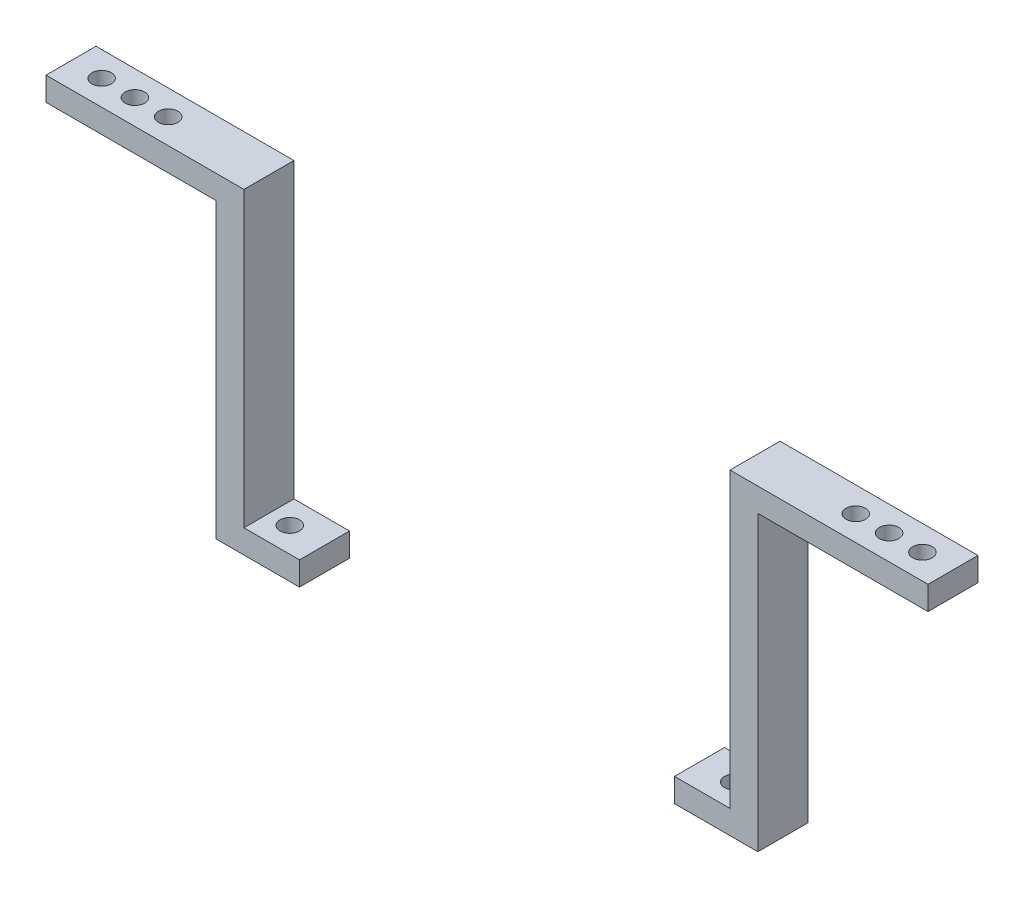
ISO-10303-21;
HEADER;
FILE_DESCRIPTION(('STEP AP214'),'2;1');
FILE_NAME('part.step','',(''),(''),'','','');
FILE_SCHEMA(('AUTOMOTIVE_DESIGN { 1 0 10303 214 1 1 1 1 }'));
ENDSEC;
DATA;
#1=APPLICATION_CONTEXT('core data for automotive mechanical design processes');
#2=APPLICATION_PROTOCOL_DEFINITION('international standard','automotive_design',2000,#1);
#3=PRODUCT_CONTEXT('',#1,'mechanical');
#4=PRODUCT('Part','Part','',(#3));
#5=PRODUCT_RELATED_PRODUCT_CATEGORY('part','',(#4));
#6=PRODUCT_DEFINITION_FORMATION('','',#4);
#7=PRODUCT_DEFINITION_CONTEXT('part definition',#1,'design');
#8=PRODUCT_DEFINITION('design','',#6,#7);
#9=PRODUCT_DEFINITION_SHAPE('','',#8);
#10=(LENGTH_UNIT() NAMED_UNIT(*) SI_UNIT(.MILLI.,.METRE.));
#11=(NAMED_UNIT(*) PLANE_ANGLE_UNIT() SI_UNIT($,.RADIAN.));
#12=(NAMED_UNIT(*) SI_UNIT($,.STERADIAN.) SOLID_ANGLE_UNIT());
#13=UNCERTAINTY_MEASURE_WITH_UNIT(LENGTH_MEASURE(1.E-05),#10,'distance_accuracy_value','');
#14=(GEOMETRIC_REPRESENTATION_CONTEXT(3) GLOBAL_UNCERTAINTY_ASSIGNED_CONTEXT((#13)) GLOBAL_UNIT_ASSIGNED_CONTEXT((#10,
#11,#12)) REPRESENTATION_CONTEXT('',''));
#15=CARTESIAN_POINT('',(0.,0.,0.));
#16=DIRECTION('',(0.,0.,1.));
#17=DIRECTION('',(1.,0.,0.));
#18=AXIS2_PLACEMENT_3D('',#15,#16,#17);
#19=CARTESIAN_POINT('',(0.,4.318,0.));
#20=DIRECTION('',(0.,1.,0.));
#21=DIRECTION('',(0.,0.,1.));
#22=AXIS2_PLACEMENT_3D('',#19,#20,#21);
#23=PLANE('',#22);
#24=DIRECTION('',(0.,0.,1.));
#25=VECTOR('',#24,1.);
#26=CARTESIAN_POINT('',(44.45,4.318,4.572));
#27=LINE('',#26,#25);
#28=CARTESIAN_POINT('',(44.45,4.318,-4.572));
#29=VERTEX_POINT('',#28);
#30=CARTESIAN_POINT('',(44.45,4.318,4.572));
#31=VERTEX_POINT('',#30);
#32=EDGE_CURVE('E60',#29,#31,#27,.T.);
#33=ORIENTED_EDGE('',*,*,#32,.F.);
#34=DIRECTION('',(-1.,0.,0.));
#35=VECTOR('',#34,1.);
#36=CARTESIAN_POINT('',(34.29,4.318,-4.572));
#37=LINE('',#36,#35);
#38=CARTESIAN_POINT('',(34.29,4.318,-4.572));
#39=VERTEX_POINT('',#38);
#40=EDGE_CURVE('E65',#29,#39,#37,.T.);
#41=ORIENTED_EDGE('',*,*,#40,.T.);
#42=DIRECTION('',(0.,0.,1.));
#43=VECTOR('',#42,1.);
#44=CARTESIAN_POINT('',(34.29,4.318,-4.572));
#45=LINE('',#44,#43);
#46=CARTESIAN_POINT('',(34.29,4.318,4.572));
#47=VERTEX_POINT('',#46);
#48=EDGE_CURVE('E96',#39,#47,#45,.T.);
#49=ORIENTED_EDGE('',*,*,#48,.T.);
#50=DIRECTION('',(1.,0.,0.));
#51=VECTOR('',#50,1.);
#52=CARTESIAN_POINT('',(34.29,4.318,4.572));
#53=LINE('',#52,#51);
#54=EDGE_CURVE('E118',#47,#31,#53,.T.);
#55=ORIENTED_EDGE('',*,*,#54,.T.);
#56=EDGE_LOOP('',(#33,#41,#49,#55));
#57=FACE_BOUND('',#56,.T.);
#58=CARTESIAN_POINT('',(40.64,4.318,0.));
#59=DIRECTION('',(0.,1.,0.));
#60=DIRECTION('',(0.,0.,1.));
#61=AXIS2_PLACEMENT_3D('',#58,#59,#60);
#62=CIRCLE('',#61,1.778);
#63=CARTESIAN_POINT('',(40.64,4.318,1.778));
#64=VERTEX_POINT('',#63);
#65=EDGE_CURVE('E107',#64,#64,#62,.T.);
#66=ORIENTED_EDGE('',*,*,#65,.F.);
#67=EDGE_LOOP('',(#66));
#68=FACE_BOUND('',#67,.T.);
#69=ADVANCED_FACE('F43',(#57,#68),#23,.T.);
#70=CARTESIAN_POINT('',(0.,0.,0.));
#71=DIRECTION('',(0.,1.,0.));
#72=DIRECTION('',(0.,0.,1.));
#73=AXIS2_PLACEMENT_3D('',#70,#71,#72);
#74=PLANE('',#73);
#75=DIRECTION('',(0.,0.,1.));
#76=VECTOR('',#75,1.);
#77=CARTESIAN_POINT('',(34.29,0.,-4.572));
#78=LINE('',#77,#76);
#79=CARTESIAN_POINT('',(34.29,0.,-4.572));
#80=VERTEX_POINT('',#79);
#81=CARTESIAN_POINT('',(34.29,0.,4.572));
#82=VERTEX_POINT('',#81);
#83=EDGE_CURVE('E102',#80,#82,#78,.T.);
#84=ORIENTED_EDGE('',*,*,#83,.F.);
#85=DIRECTION('',(-1.,0.,0.));
#86=VECTOR('',#85,1.);
#87=CARTESIAN_POINT('',(34.29,0.,-4.572));
#88=LINE('',#87,#86);
#89=CARTESIAN_POINT('',(49.53,0.,-4.572));
#90=VERTEX_POINT('',#89);
#91=EDGE_CURVE('E85',#90,#80,#88,.T.);
#92=ORIENTED_EDGE('',*,*,#91,.F.);
#93=DIRECTION('',(0.,0.,-1.));
#94=VECTOR('',#93,1.);
#95=CARTESIAN_POINT('',(49.53,0.,-4.572));
#96=LINE('',#95,#94);
#97=CARTESIAN_POINT('',(49.53,0.,4.572));
#98=VERTEX_POINT('',#97);
#99=EDGE_CURVE('E97',#98,#90,#96,.T.);
#100=ORIENTED_EDGE('',*,*,#99,.F.);
#101=DIRECTION('',(1.,0.,0.));
#102=VECTOR('',#101,1.);
#103=CARTESIAN_POINT('',(34.29,0.,4.572));
#104=LINE('',#103,#102);
#105=EDGE_CURVE('E106',#82,#98,#104,.T.);
#106=ORIENTED_EDGE('',*,*,#105,.F.);
#107=EDGE_LOOP('',(#84,#92,#100,#106));
#108=FACE_BOUND('',#107,.T.);
#109=CARTESIAN_POINT('',(40.64,0.,0.));
#110=DIRECTION('',(0.,1.,0.));
#111=DIRECTION('',(0.,0.,1.));
#112=AXIS2_PLACEMENT_3D('',#109,#110,#111);
#113=CIRCLE('',#112,1.778);
#114=CARTESIAN_POINT('',(40.64,0.,1.778));
#115=VERTEX_POINT('',#114);
#116=EDGE_CURVE('E111',#115,#115,#113,.T.);
#117=ORIENTED_EDGE('',*,*,#116,.T.);
#118=EDGE_LOOP('',(#117));
#119=FACE_BOUND('',#118,.T.);
#120=ADVANCED_FACE('F104',(#108,#119),#74,.F.);
#121=CARTESIAN_POINT('',(34.29,4.318,-4.572));
#122=DIRECTION('',(1.,0.,0.));
#123=DIRECTION('',(0.,0.,-1.));
#124=AXIS2_PLACEMENT_3D('',#121,#122,#123);
#125=PLANE('',#124);
#126=ORIENTED_EDGE('',*,*,#83,.T.);
#127=DIRECTION('',(0.,-1.,0.));
#128=VECTOR('',#127,1.);
#129=CARTESIAN_POINT('',(34.29,4.318,4.572));
#130=LINE('',#129,#128);
#131=EDGE_CURVE('E12',#47,#82,#130,.T.);
#132=ORIENTED_EDGE('',*,*,#131,.F.);
#133=ORIENTED_EDGE('',*,*,#48,.F.);
#134=DIRECTION('',(0.,-1.,0.));
#135=VECTOR('',#134,1.);
#136=CARTESIAN_POINT('',(34.29,4.318,-4.572));
#137=LINE('',#136,#135);
#138=EDGE_CURVE('E88',#39,#80,#137,.T.);
#139=ORIENTED_EDGE('',*,*,#138,.T.);
#140=EDGE_LOOP('',(#126,#132,#133,#139));
#141=FACE_BOUND('',#140,.T.);
#142=ADVANCED_FACE('F45',(#141),#125,.F.);
#143=CARTESIAN_POINT('',(34.29,4.318,4.572));
#144=DIRECTION('',(0.,0.,-1.));
#145=DIRECTION('',(-1.,0.,0.));
#146=AXIS2_PLACEMENT_3D('',#143,#144,#145);
#147=PLANE('',#146);
#148=ORIENTED_EDGE('',*,*,#105,.T.);
#149=DIRECTION('',(0.,-1.,0.));
#150=VECTOR('',#149,1.);
#151=CARTESIAN_POINT('',(49.53,4.318,4.572));
#152=LINE('',#151,#150);
#153=CARTESIAN_POINT('',(49.53,53.594,4.572));
#154=VERTEX_POINT('',#153);
#155=EDGE_CURVE('E52',#154,#98,#152,.T.);
#156=ORIENTED_EDGE('',*,*,#155,.F.);
#157=DIRECTION('',(1.,0.,0.));
#158=VECTOR('',#157,1.);
#159=CARTESIAN_POINT('',(44.45,53.594,4.572));
#160=LINE('',#159,#158);
#161=CARTESIAN_POINT('',(80.645,53.594,4.57199999999999));
#162=VERTEX_POINT('',#161);
#163=EDGE_CURVE('E154',#154,#162,#160,.T.);
#164=ORIENTED_EDGE('',*,*,#163,.T.);
#165=DIRECTION('',(0.,-1.,0.));
#166=VECTOR('',#165,1.);
#167=CARTESIAN_POINT('',(80.645,57.912,4.57199999999999));
#168=LINE('',#167,#166);
#169=CARTESIAN_POINT('',(80.645,57.912,4.57199999999999));
#170=VERTEX_POINT('',#169);
#171=EDGE_CURVE('E133',#170,#162,#168,.T.);
#172=ORIENTED_EDGE('',*,*,#171,.F.);
#173=DIRECTION('',(1.,0.,0.));
#174=VECTOR('',#173,1.);
#175=CARTESIAN_POINT('',(44.45,57.912,4.572));
#176=LINE('',#175,#174);
#177=CARTESIAN_POINT('',(44.45,57.912,4.572));
#178=VERTEX_POINT('',#177);
#179=EDGE_CURVE('E175',#178,#170,#176,.T.);
#180=ORIENTED_EDGE('',*,*,#179,.F.);
#181=DIRECTION('',(0.,-1.,0.));
#182=VECTOR('',#181,1.);
#183=CARTESIAN_POINT('',(44.45,53.594,4.572));
#184=LINE('',#183,#182);
#185=EDGE_CURVE('E134',#178,#31,#184,.T.);
#186=ORIENTED_EDGE('',*,*,#185,.T.);
#187=ORIENTED_EDGE('',*,*,#54,.F.);
#188=ORIENTED_EDGE('',*,*,#131,.T.);
#189=EDGE_LOOP('',(#148,#156,#164,#172,#180,#186,#187,#188));
#190=FACE_BOUND('',#189,.T.);
#191=ADVANCED_FACE('F228',(#190),#147,.F.);
#192=CARTESIAN_POINT('',(49.53,4.318,-4.572));
#193=DIRECTION('',(-1.,0.,0.));
#194=DIRECTION('',(0.,0.,1.));
#195=AXIS2_PLACEMENT_3D('',#192,#193,#194);
#196=PLANE('',#195);
#197=ORIENTED_EDGE('',*,*,#99,.T.);
#198=DIRECTION('',(0.,-1.,0.));
#199=VECTOR('',#198,1.);
#200=CARTESIAN_POINT('',(49.53,4.318,-4.572));
#201=LINE('',#200,#199);
#202=CARTESIAN_POINT('',(49.53,53.594,-4.572));
#203=VERTEX_POINT('',#202);
#204=EDGE_CURVE('E92',#203,#90,#201,.T.);
#205=ORIENTED_EDGE('',*,*,#204,.F.);
#206=DIRECTION('',(0.,0.,-1.));
#207=VECTOR('',#206,1.);
#208=CARTESIAN_POINT('',(49.53,53.594,4.572));
#209=LINE('',#208,#207);
#210=EDGE_CURVE('E132',#154,#203,#209,.T.);
#211=ORIENTED_EDGE('',*,*,#210,.F.);
#212=ORIENTED_EDGE('',*,*,#155,.T.);
#213=EDGE_LOOP('',(#197,#205,#211,#212));
#214=FACE_BOUND('',#213,.T.);
#215=ADVANCED_FACE('F229',(#214),#196,.F.);
#216=CARTESIAN_POINT('',(34.29,4.318,-4.572));
#217=DIRECTION('',(0.,0.,1.));
#218=DIRECTION('',(1.,0.,0.));
#219=AXIS2_PLACEMENT_3D('',#216,#217,#218);
#220=PLANE('',#219);
#221=ORIENTED_EDGE('',*,*,#91,.T.);
#222=ORIENTED_EDGE('',*,*,#138,.F.);
#223=ORIENTED_EDGE('',*,*,#40,.F.);
#224=DIRECTION('',(0.,-1.,0.));
#225=VECTOR('',#224,1.);
#226=CARTESIAN_POINT('',(44.45,53.594,-4.572));
#227=LINE('',#226,#225);
#228=CARTESIAN_POINT('',(44.45,57.912,-4.572));
#229=VERTEX_POINT('',#228);
#230=EDGE_CURVE('E125',#229,#29,#227,.T.);
#231=ORIENTED_EDGE('',*,*,#230,.F.);
#232=DIRECTION('',(-1.,0.,0.));
#233=VECTOR('',#232,1.);
#234=CARTESIAN_POINT('',(44.45,57.912,-4.572));
#235=LINE('',#234,#233);
#236=CARTESIAN_POINT('',(80.645,57.912,-4.57200000000001));
#237=VERTEX_POINT('',#236);
#238=EDGE_CURVE('E182',#237,#229,#235,.T.);
#239=ORIENTED_EDGE('',*,*,#238,.F.);
#240=DIRECTION('',(0.,-1.,0.));
#241=VECTOR('',#240,1.);
#242=CARTESIAN_POINT('',(80.645,57.912,-4.57200000000001));
#243=LINE('',#242,#241);
#244=CARTESIAN_POINT('',(80.645,53.594,-4.57200000000001));
#245=VERTEX_POINT('',#244);
#246=EDGE_CURVE('E185',#237,#245,#243,.T.);
#247=ORIENTED_EDGE('',*,*,#246,.T.);
#248=DIRECTION('',(-1.,0.,0.));
#249=VECTOR('',#248,1.);
#250=CARTESIAN_POINT('',(44.45,53.594,-4.572));
#251=LINE('',#250,#249);
#252=EDGE_CURVE('E176',#245,#203,#251,.T.);
#253=ORIENTED_EDGE('',*,*,#252,.T.);
#254=ORIENTED_EDGE('',*,*,#204,.T.);
#255=EDGE_LOOP('',(#221,#222,#223,#231,#239,#247,#253,#254));
#256=FACE_BOUND('',#255,.T.);
#257=ADVANCED_FACE('F87',(#256),#220,.F.);
#258=CARTESIAN_POINT('',(40.64,4.318,0.));
#259=DIRECTION('',(0.,-1.,0.));
#260=DIRECTION('',(0.,0.,-1.));
#261=AXIS2_PLACEMENT_3D('',#258,#259,#260);
#262=CYLINDRICAL_SURFACE('',#261,1.778);
#263=ORIENTED_EDGE('',*,*,#65,.T.);
#264=EDGE_LOOP('',(#263));
#265=FACE_BOUND('',#264,.T.);
#266=ORIENTED_EDGE('',*,*,#116,.F.);
#267=EDGE_LOOP('',(#266));
#268=FACE_BOUND('',#267,.T.);
#269=ADVANCED_FACE('F236',(#265,#268),#262,.F.);
#270=CARTESIAN_POINT('',(44.45,53.594,4.572));
#271=DIRECTION('',(1.,0.,0.));
#272=DIRECTION('',(0.,0.,-1.));
#273=AXIS2_PLACEMENT_3D('',#270,#271,#272);
#274=PLANE('',#273);
#275=ORIENTED_EDGE('',*,*,#32,.T.);
#276=ORIENTED_EDGE('',*,*,#185,.F.);
#277=DIRECTION('',(0.,0.,1.));
#278=VECTOR('',#277,1.);
#279=CARTESIAN_POINT('',(44.45,57.912,4.572));
#280=LINE('',#279,#278);
#281=EDGE_CURVE('E172',#229,#178,#280,.T.);
#282=ORIENTED_EDGE('',*,*,#281,.F.);
#283=ORIENTED_EDGE('',*,*,#230,.T.);
#284=EDGE_LOOP('',(#275,#276,#282,#283));
#285=FACE_BOUND('',#284,.T.);
#286=ADVANCED_FACE('F248',(#285),#274,.F.);
#287=CARTESIAN_POINT('',(80.645,57.912,4.57199999999999));
#288=DIRECTION('',(-1.,0.,0.));
#289=DIRECTION('',(0.,0.,1.));
#290=AXIS2_PLACEMENT_3D('',#287,#288,#289);
#291=PLANE('',#290);
#292=DIRECTION('',(0.,0.,-1.));
#293=VECTOR('',#292,1.);
#294=CARTESIAN_POINT('',(80.645,53.594,4.57199999999999));
#295=LINE('',#294,#293);
#296=EDGE_CURVE('E188',#162,#245,#295,.T.);
#297=ORIENTED_EDGE('',*,*,#296,.T.);
#298=ORIENTED_EDGE('',*,*,#246,.F.);
#299=DIRECTION('',(0.,0.,-1.));
#300=VECTOR('',#299,1.);
#301=CARTESIAN_POINT('',(80.645,57.912,4.57199999999999));
#302=LINE('',#301,#300);
#303=EDGE_CURVE('E179',#170,#237,#302,.T.);
#304=ORIENTED_EDGE('',*,*,#303,.F.);
#305=ORIENTED_EDGE('',*,*,#171,.T.);
#306=EDGE_LOOP('',(#297,#298,#304,#305));
#307=FACE_BOUND('',#306,.T.);
#308=ADVANCED_FACE('F207',(#307),#291,.F.);
#309=CARTESIAN_POINT('',(0.,57.912,0.));
#310=DIRECTION('',(0.,-1.,0.));
#311=DIRECTION('',(0.,0.,-1.));
#312=AXIS2_PLACEMENT_3D('',#309,#310,#311);
#313=PLANE('',#312);
#314=CARTESIAN_POINT('',(62.865,57.912,0.));
#315=DIRECTION('',(0.,1.,0.));
#316=DIRECTION('',(0.,0.,1.));
#317=AXIS2_PLACEMENT_3D('',#314,#315,#316);
#318=CIRCLE('',#317,1.77800000000001);
#319=CARTESIAN_POINT('',(62.865,57.912,1.77800000000001));
#320=VERTEX_POINT('',#319);
#321=EDGE_CURVE('E158',#320,#320,#318,.T.);
#322=ORIENTED_EDGE('',*,*,#321,.F.);
#323=EDGE_LOOP('',(#322));
#324=FACE_BOUND('',#323,.T.);
#325=CARTESIAN_POINT('',(68.961,57.912,0.));
#326=DIRECTION('',(0.,1.,0.));
#327=DIRECTION('',(0.,0.,1.));
#328=AXIS2_PLACEMENT_3D('',#325,#326,#327);
#329=CIRCLE('',#328,1.77800000000001);
#330=CARTESIAN_POINT('',(68.961,57.912,1.77800000000001));
#331=VERTEX_POINT('',#330);
#332=EDGE_CURVE('E163',#331,#331,#329,.T.);
#333=ORIENTED_EDGE('',*,*,#332,.F.);
#334=EDGE_LOOP('',(#333));
#335=FACE_BOUND('',#334,.T.);
#336=CARTESIAN_POINT('',(75.057,57.912,0.));
#337=DIRECTION('',(0.,1.,0.));
#338=DIRECTION('',(0.,0.,1.));
#339=AXIS2_PLACEMENT_3D('',#336,#337,#338);
#340=CIRCLE('',#339,1.77800000000001);
#341=CARTESIAN_POINT('',(75.057,57.912,1.77800000000001));
#342=VERTEX_POINT('',#341);
#343=EDGE_CURVE('E155',#342,#342,#340,.T.);
#344=ORIENTED_EDGE('',*,*,#343,.F.);
#345=EDGE_LOOP('',(#344));
#346=FACE_BOUND('',#345,.T.);
#347=ORIENTED_EDGE('',*,*,#281,.T.);
#348=ORIENTED_EDGE('',*,*,#179,.T.);
#349=ORIENTED_EDGE('',*,*,#303,.T.);
#350=ORIENTED_EDGE('',*,*,#238,.T.);
#351=EDGE_LOOP('',(#347,#348,#349,#350));
#352=FACE_BOUND('',#351,.T.);
#353=ADVANCED_FACE('F255',(#324,#335,#346,#352),#313,.F.);
#354=CARTESIAN_POINT('',(0.,53.594,0.));
#355=DIRECTION('',(0.,-1.,0.));
#356=DIRECTION('',(0.,0.,-1.));
#357=AXIS2_PLACEMENT_3D('',#354,#355,#356);
#358=PLANE('',#357);
#359=CARTESIAN_POINT('',(62.865,53.594,0.));
#360=DIRECTION('',(0.,-1.,0.));
#361=DIRECTION('',(0.,0.,-1.));
#362=AXIS2_PLACEMENT_3D('',#359,#360,#361);
#363=CIRCLE('',#362,1.77800000000001);
#364=CARTESIAN_POINT('',(62.865,53.594,-1.77800000000001));
#365=VERTEX_POINT('',#364);
#366=EDGE_CURVE('E47',#365,#365,#363,.T.);
#367=ORIENTED_EDGE('',*,*,#366,.F.);
#368=EDGE_LOOP('',(#367));
#369=FACE_BOUND('',#368,.T.);
#370=CARTESIAN_POINT('',(68.961,53.594,0.));
#371=DIRECTION('',(0.,-1.,0.));
#372=DIRECTION('',(0.,0.,-1.));
#373=AXIS2_PLACEMENT_3D('',#370,#371,#372);
#374=CIRCLE('',#373,1.77800000000001);
#375=CARTESIAN_POINT('',(68.961,53.594,-1.77800000000001));
#376=VERTEX_POINT('',#375);
#377=EDGE_CURVE('E156',#376,#376,#374,.T.);
#378=ORIENTED_EDGE('',*,*,#377,.F.);
#379=EDGE_LOOP('',(#378));
#380=FACE_BOUND('',#379,.T.);
#381=CARTESIAN_POINT('',(75.057,53.594,0.));
#382=DIRECTION('',(0.,-1.,0.));
#383=DIRECTION('',(0.,0.,-1.));
#384=AXIS2_PLACEMENT_3D('',#381,#382,#383);
#385=CIRCLE('',#384,1.77800000000001);
#386=CARTESIAN_POINT('',(75.057,53.594,-1.77800000000001));
#387=VERTEX_POINT('',#386);
#388=EDGE_CURVE('E152',#387,#387,#385,.T.);
#389=ORIENTED_EDGE('',*,*,#388,.F.);
#390=EDGE_LOOP('',(#389));
#391=FACE_BOUND('',#390,.T.);
#392=ORIENTED_EDGE('',*,*,#163,.F.);
#393=ORIENTED_EDGE('',*,*,#210,.T.);
#394=ORIENTED_EDGE('',*,*,#252,.F.);
#395=ORIENTED_EDGE('',*,*,#296,.F.);
#396=EDGE_LOOP('',(#392,#393,#394,#395));
#397=FACE_BOUND('',#396,.T.);
#398=ADVANCED_FACE('F214',(#369,#380,#391,#397),#358,.T.);
#399=CARTESIAN_POINT('',(75.057,-2.50000000007189E-05,0.));
#400=DIRECTION('',(0.,1.,0.));
#401=DIRECTION('',(0.,0.,1.));
#402=AXIS2_PLACEMENT_3D('',#399,#400,#401);
#403=CYLINDRICAL_SURFACE('',#402,1.77800000000001);
#404=ORIENTED_EDGE('',*,*,#388,.T.);
#405=EDGE_LOOP('',(#404));
#406=FACE_BOUND('',#405,.T.);
#407=ORIENTED_EDGE('',*,*,#343,.T.);
#408=EDGE_LOOP('',(#407));
#409=FACE_BOUND('',#408,.T.);
#410=ADVANCED_FACE('F258',(#406,#409),#403,.F.);
#411=CARTESIAN_POINT('',(68.961,-2.50000000007189E-05,0.));
#412=DIRECTION('',(0.,1.,0.));
#413=DIRECTION('',(0.,0.,1.));
#414=AXIS2_PLACEMENT_3D('',#411,#412,#413);
#415=CYLINDRICAL_SURFACE('',#414,1.77800000000001);
#416=ORIENTED_EDGE('',*,*,#377,.T.);
#417=EDGE_LOOP('',(#416));
#418=FACE_BOUND('',#417,.T.);
#419=ORIENTED_EDGE('',*,*,#332,.T.);
#420=EDGE_LOOP('',(#419));
#421=FACE_BOUND('',#420,.T.);
#422=ADVANCED_FACE('F265',(#418,#421),#415,.F.);
#423=CARTESIAN_POINT('',(62.865,-2.50000000007189E-05,0.));
#424=DIRECTION('',(0.,1.,0.));
#425=DIRECTION('',(0.,0.,1.));
#426=AXIS2_PLACEMENT_3D('',#423,#424,#425);
#427=CYLINDRICAL_SURFACE('',#426,1.77800000000001);
#428=ORIENTED_EDGE('',*,*,#366,.T.);
#429=EDGE_LOOP('',(#428));
#430=FACE_BOUND('',#429,.T.);
#431=ORIENTED_EDGE('',*,*,#321,.T.);
#432=EDGE_LOOP('',(#431));
#433=FACE_BOUND('',#432,.T.);
#434=ADVANCED_FACE('F269',(#430,#433),#427,.F.);
#435=CLOSED_SHELL('',(#69,#120,#142,#191,#215,#257,#269,#286,#308,#353,#398,#410,#422,#434));
#436=MANIFOLD_SOLID_BREP('B2',#435);
#437=CARTESIAN_POINT('',(0.,4.318,0.));
#438=DIRECTION('',(0.,1.,0.));
#439=DIRECTION('',(0.,0.,1.));
#440=AXIS2_PLACEMENT_3D('',#437,#438,#439);
#441=PLANE('',#440);
#442=DIRECTION('',(0.,0.,-1.));
#443=VECTOR('',#442,1.);
#444=CARTESIAN_POINT('',(-44.45,4.318,-4.572));
#445=LINE('',#444,#443);
#446=CARTESIAN_POINT('',(-44.45,4.318,4.572));
#447=VERTEX_POINT('',#446);
#448=CARTESIAN_POINT('',(-44.45,4.318,-4.572));
#449=VERTEX_POINT('',#448);
#450=EDGE_CURVE('E410',#447,#449,#445,.T.);
#451=ORIENTED_EDGE('',*,*,#450,.F.);
#452=DIRECTION('',(1.,0.,0.));
#453=VECTOR('',#452,1.);
#454=CARTESIAN_POINT('',(-49.53,4.318,4.572));
#455=LINE('',#454,#453);
#456=CARTESIAN_POINT('',(-34.29,4.318,4.572));
#457=VERTEX_POINT('',#456);
#458=EDGE_CURVE('E447',#447,#457,#455,.T.);
#459=ORIENTED_EDGE('',*,*,#458,.T.);
#460=DIRECTION('',(0.,0.,-1.));
#461=VECTOR('',#460,1.);
#462=CARTESIAN_POINT('',(-34.29,4.318,-4.572));
#463=LINE('',#462,#461);
#464=CARTESIAN_POINT('',(-34.29,4.318,-4.572));
#465=VERTEX_POINT('',#464);
#466=EDGE_CURVE('E416',#457,#465,#463,.T.);
#467=ORIENTED_EDGE('',*,*,#466,.T.);
#468=DIRECTION('',(-1.,0.,0.));
#469=VECTOR('',#468,1.);
#470=CARTESIAN_POINT('',(-49.53,4.318,-4.572));
#471=LINE('',#470,#469);
#472=EDGE_CURVE('E457',#465,#449,#471,.T.);
#473=ORIENTED_EDGE('',*,*,#472,.T.);
#474=EDGE_LOOP('',(#451,#459,#467,#473));
#475=FACE_BOUND('',#474,.T.);
#476=CARTESIAN_POINT('',(-40.64,4.318,0.));
#477=DIRECTION('',(0.,1.,0.));
#478=DIRECTION('',(0.,0.,1.));
#479=AXIS2_PLACEMENT_3D('',#476,#477,#478);
#480=CIRCLE('',#479,1.778);
#481=CARTESIAN_POINT('',(-40.64,4.318,1.778));
#482=VERTEX_POINT('',#481);
#483=EDGE_CURVE('E461',#482,#482,#480,.T.);
#484=ORIENTED_EDGE('',*,*,#483,.F.);
#485=EDGE_LOOP('',(#484));
#486=FACE_BOUND('',#485,.T.);
#487=ADVANCED_FACE('F393',(#475,#486),#441,.T.);
#488=CARTESIAN_POINT('',(0.,0.,0.));
#489=DIRECTION('',(0.,1.,0.));
#490=DIRECTION('',(0.,0.,1.));
#491=AXIS2_PLACEMENT_3D('',#488,#489,#490);
#492=PLANE('',#491);
#493=DIRECTION('',(0.,0.,1.));
#494=VECTOR('',#493,1.);
#495=CARTESIAN_POINT('',(-49.53,0.,-4.572));
#496=LINE('',#495,#494);
#497=CARTESIAN_POINT('',(-49.53,0.,-4.572));
#498=VERTEX_POINT('',#497);
#499=CARTESIAN_POINT('',(-49.53,0.,4.572));
#500=VERTEX_POINT('',#499);
#501=EDGE_CURVE('E453',#498,#500,#496,.T.);
#502=ORIENTED_EDGE('',*,*,#501,.F.);
#503=DIRECTION('',(-1.,0.,0.));
#504=VECTOR('',#503,1.);
#505=CARTESIAN_POINT('',(-49.53,0.,-4.572));
#506=LINE('',#505,#504);
#507=CARTESIAN_POINT('',(-34.29,0.,-4.572));
#508=VERTEX_POINT('',#507);
#509=EDGE_CURVE('E436',#508,#498,#506,.T.);
#510=ORIENTED_EDGE('',*,*,#509,.F.);
#511=DIRECTION('',(0.,0.,-1.));
#512=VECTOR('',#511,1.);
#513=CARTESIAN_POINT('',(-34.29,0.,-4.572));
#514=LINE('',#513,#512);
#515=CARTESIAN_POINT('',(-34.29,0.,4.572));
#516=VERTEX_POINT('',#515);
#517=EDGE_CURVE('E448',#516,#508,#514,.T.);
#518=ORIENTED_EDGE('',*,*,#517,.F.);
#519=DIRECTION('',(1.,0.,0.));
#520=VECTOR('',#519,1.);
#521=CARTESIAN_POINT('',(-49.53,0.,4.572));
#522=LINE('',#521,#520);
#523=EDGE_CURVE('E460',#500,#516,#522,.T.);
#524=ORIENTED_EDGE('',*,*,#523,.F.);
#525=EDGE_LOOP('',(#502,#510,#518,#524));
#526=FACE_BOUND('',#525,.T.);
#527=CARTESIAN_POINT('',(-40.64,0.,0.));
#528=DIRECTION('',(0.,1.,0.));
#529=DIRECTION('',(0.,0.,1.));
#530=AXIS2_PLACEMENT_3D('',#527,#528,#529);
#531=CIRCLE('',#530,1.778);
#532=CARTESIAN_POINT('',(-40.64,0.,1.778));
#533=VERTEX_POINT('',#532);
#534=EDGE_CURVE('E465',#533,#533,#531,.T.);
#535=ORIENTED_EDGE('',*,*,#534,.T.);
#536=EDGE_LOOP('',(#535));
#537=FACE_BOUND('',#536,.T.);
#538=ADVANCED_FACE('F458',(#526,#537),#492,.F.);
#539=CARTESIAN_POINT('',(-49.53,4.318,-4.572));
#540=DIRECTION('',(1.,0.,0.));
#541=DIRECTION('',(0.,0.,-1.));
#542=AXIS2_PLACEMENT_3D('',#539,#540,#541);
#543=PLANE('',#542);
#544=ORIENTED_EDGE('',*,*,#501,.T.);
#545=DIRECTION('',(0.,-1.,0.));
#546=VECTOR('',#545,1.);
#547=CARTESIAN_POINT('',(-49.53,4.318,4.572));
#548=LINE('',#547,#546);
#549=CARTESIAN_POINT('',(-49.53,53.594,4.572));
#550=VERTEX_POINT('',#549);
#551=EDGE_CURVE('E41',#550,#500,#548,.T.);
#552=ORIENTED_EDGE('',*,*,#551,.F.);
#553=DIRECTION('',(0.,0.,1.));
#554=VECTOR('',#553,1.);
#555=CARTESIAN_POINT('',(-49.53,53.594,-4.572));
#556=LINE('',#555,#554);
#557=CARTESIAN_POINT('',(-49.53,53.594,-4.572));
#558=VERTEX_POINT('',#557);
#559=EDGE_CURVE('E455',#558,#550,#556,.T.);
#560=ORIENTED_EDGE('',*,*,#559,.F.);
#561=DIRECTION('',(0.,-1.,0.));
#562=VECTOR('',#561,1.);
#563=CARTESIAN_POINT('',(-49.53,4.318,-4.572));
#564=LINE('',#563,#562);
#565=EDGE_CURVE('E440',#558,#498,#564,.T.);
#566=ORIENTED_EDGE('',*,*,#565,.T.);
#567=EDGE_LOOP('',(#544,#552,#560,#566));
#568=FACE_BOUND('',#567,.T.);
#569=ADVANCED_FACE('F395',(#568),#543,.F.);
#570=CARTESIAN_POINT('',(-49.53,4.318,4.572));
#571=DIRECTION('',(0.,0.,-1.));
#572=DIRECTION('',(-1.,0.,0.));
#573=AXIS2_PLACEMENT_3D('',#570,#571,#572);
#574=PLANE('',#573);
#575=ORIENTED_EDGE('',*,*,#523,.T.);
#576=DIRECTION('',(0.,-1.,0.));
#577=VECTOR('',#576,1.);
#578=CARTESIAN_POINT('',(-34.29,4.318,4.572));
#579=LINE('',#578,#577);
#580=EDGE_CURVE('E402',#457,#516,#579,.T.);
#581=ORIENTED_EDGE('',*,*,#580,.F.);
#582=ORIENTED_EDGE('',*,*,#458,.F.);
#583=DIRECTION('',(0.,-1.,0.));
#584=VECTOR('',#583,1.);
#585=CARTESIAN_POINT('',(-44.45,53.594,4.572));
#586=LINE('',#585,#584);
#587=CARTESIAN_POINT('',(-44.45,57.912,4.572));
#588=VERTEX_POINT('',#587);
#589=EDGE_CURVE('E493',#588,#447,#586,.T.);
#590=ORIENTED_EDGE('',*,*,#589,.F.);
#591=DIRECTION('',(1.,0.,0.));
#592=VECTOR('',#591,1.);
#593=CARTESIAN_POINT('',(-44.45,57.912,4.572));
#594=LINE('',#593,#592);
#595=CARTESIAN_POINT('',(-80.645,57.912,4.572));
#596=VERTEX_POINT('',#595);
#597=EDGE_CURVE('E523',#596,#588,#594,.T.);
#598=ORIENTED_EDGE('',*,*,#597,.F.);
#599=DIRECTION('',(0.,-1.,0.));
#600=VECTOR('',#599,1.);
#601=CARTESIAN_POINT('',(-80.645,57.912,4.572));
#602=LINE('',#601,#600);
#603=CARTESIAN_POINT('',(-80.645,53.594,4.572));
#604=VERTEX_POINT('',#603);
#605=EDGE_CURVE('E528',#596,#604,#602,.T.);
#606=ORIENTED_EDGE('',*,*,#605,.T.);
#607=DIRECTION('',(1.,0.,0.));
#608=VECTOR('',#607,1.);
#609=CARTESIAN_POINT('',(-44.45,53.594,4.572));
#610=LINE('',#609,#608);
#611=EDGE_CURVE('E517',#604,#550,#610,.T.);
#612=ORIENTED_EDGE('',*,*,#611,.T.);
#613=ORIENTED_EDGE('',*,*,#551,.T.);
#614=EDGE_LOOP('',(#575,#581,#582,#590,#598,#606,#612,#613));
#615=FACE_BOUND('',#614,.T.);
#616=ADVANCED_FACE('F560',(#615),#574,.F.);
#617=CARTESIAN_POINT('',(-34.29,4.318,-4.572));
#618=DIRECTION('',(-1.,0.,0.));
#619=DIRECTION('',(0.,0.,1.));
#620=AXIS2_PLACEMENT_3D('',#617,#618,#619);
#621=PLANE('',#620);
#622=ORIENTED_EDGE('',*,*,#517,.T.);
#623=DIRECTION('',(0.,-1.,0.));
#624=VECTOR('',#623,1.);
#625=CARTESIAN_POINT('',(-34.29,4.318,-4.572));
#626=LINE('',#625,#624);
#627=EDGE_CURVE('E443',#465,#508,#626,.T.);
#628=ORIENTED_EDGE('',*,*,#627,.F.);
#629=ORIENTED_EDGE('',*,*,#466,.F.);
#630=ORIENTED_EDGE('',*,*,#580,.T.);
#631=EDGE_LOOP('',(#622,#628,#629,#630));
#632=FACE_BOUND('',#631,.T.);
#633=ADVANCED_FACE('F568',(#632),#621,.F.);
#634=CARTESIAN_POINT('',(-49.53,4.318,-4.572));
#635=DIRECTION('',(0.,0.,1.));
#636=DIRECTION('',(1.,0.,0.));
#637=AXIS2_PLACEMENT_3D('',#634,#635,#636);
#638=PLANE('',#637);
#639=ORIENTED_EDGE('',*,*,#509,.T.);
#640=ORIENTED_EDGE('',*,*,#565,.F.);
#641=DIRECTION('',(-1.,0.,0.));
#642=VECTOR('',#641,1.);
#643=CARTESIAN_POINT('',(-44.45,53.594,-4.572));
#644=LINE('',#643,#642);
#645=CARTESIAN_POINT('',(-80.645,53.594,-4.572));
#646=VERTEX_POINT('',#645);
#647=EDGE_CURVE('E511',#558,#646,#644,.T.);
#648=ORIENTED_EDGE('',*,*,#647,.T.);
#649=DIRECTION('',(0.,-1.,0.));
#650=VECTOR('',#649,1.);
#651=CARTESIAN_POINT('',(-80.645,57.912,-4.572));
#652=LINE('',#651,#650);
#653=CARTESIAN_POINT('',(-80.645,57.912,-4.572));
#654=VERTEX_POINT('',#653);
#655=EDGE_CURVE('E494',#654,#646,#652,.T.);
#656=ORIENTED_EDGE('',*,*,#655,.F.);
#657=DIRECTION('',(-1.,0.,0.));
#658=VECTOR('',#657,1.);
#659=CARTESIAN_POINT('',(-44.45,57.912,-4.572));
#660=LINE('',#659,#658);
#661=CARTESIAN_POINT('',(-44.45,57.912,-4.572));
#662=VERTEX_POINT('',#661);
#663=EDGE_CURVE('E497',#662,#654,#660,.T.);
#664=ORIENTED_EDGE('',*,*,#663,.F.);
#665=DIRECTION('',(0.,-1.,0.));
#666=VECTOR('',#665,1.);
#667=CARTESIAN_POINT('',(-44.45,53.594,-4.572));
#668=LINE('',#667,#666);
#669=EDGE_CURVE('E490',#662,#449,#668,.T.);
#670=ORIENTED_EDGE('',*,*,#669,.T.);
#671=ORIENTED_EDGE('',*,*,#472,.F.);
#672=ORIENTED_EDGE('',*,*,#627,.T.);
#673=EDGE_LOOP('',(#639,#640,#648,#656,#664,#670,#671,#672));
#674=FACE_BOUND('',#673,.T.);
#675=ADVANCED_FACE('F438',(#674),#638,.F.);
#676=CARTESIAN_POINT('',(-40.64,4.318,0.));
#677=DIRECTION('',(0.,-1.,0.));
#678=DIRECTION('',(0.,0.,-1.));
#679=AXIS2_PLACEMENT_3D('',#676,#677,#678);
#680=CYLINDRICAL_SURFACE('',#679,1.778);
#681=ORIENTED_EDGE('',*,*,#483,.T.);
#682=EDGE_LOOP('',(#681));
#683=FACE_BOUND('',#682,.T.);
#684=ORIENTED_EDGE('',*,*,#534,.F.);
#685=EDGE_LOOP('',(#684));
#686=FACE_BOUND('',#685,.T.);
#687=ADVANCED_FACE('F575',(#683,#686),#680,.F.);
#688=CARTESIAN_POINT('',(-44.45,53.594,-4.572));
#689=DIRECTION('',(-1.,0.,0.));
#690=DIRECTION('',(0.,0.,1.));
#691=AXIS2_PLACEMENT_3D('',#688,#689,#690);
#692=PLANE('',#691);
#693=ORIENTED_EDGE('',*,*,#450,.T.);
#694=ORIENTED_EDGE('',*,*,#669,.F.);
#695=DIRECTION('',(0.,0.,-1.));
#696=VECTOR('',#695,1.);
#697=CARTESIAN_POINT('',(-44.45,57.912,4.572));
#698=LINE('',#697,#696);
#699=EDGE_CURVE('E548',#588,#662,#698,.T.);
#700=ORIENTED_EDGE('',*,*,#699,.F.);
#701=ORIENTED_EDGE('',*,*,#589,.T.);
#702=EDGE_LOOP('',(#693,#694,#700,#701));
#703=FACE_BOUND('',#702,.T.);
#704=ADVANCED_FACE('F487',(#703),#692,.F.);
#705=CARTESIAN_POINT('',(0.,53.594,0.));
#706=DIRECTION('',(0.,1.,0.));
#707=DIRECTION('',(0.,0.,1.));
#708=AXIS2_PLACEMENT_3D('',#705,#706,#707);
#709=PLANE('',#708);
#710=CARTESIAN_POINT('',(-68.961,53.594,0.));
#711=DIRECTION('',(0.,1.,0.));
#712=DIRECTION('',(0.,0.,1.));
#713=AXIS2_PLACEMENT_3D('',#710,#711,#712);
#714=CIRCLE('',#713,1.77800000000001);
#715=CARTESIAN_POINT('',(-68.961,53.594,1.77800000000001));
#716=VERTEX_POINT('',#715);
#717=EDGE_CURVE('E616',#716,#716,#714,.T.);
#718=ORIENTED_EDGE('',*,*,#717,.T.);
#719=EDGE_LOOP('',(#718));
#720=FACE_BOUND('',#719,.T.);
#721=CARTESIAN_POINT('',(-62.865,53.594,0.));
#722=DIRECTION('',(0.,1.,0.));
#723=DIRECTION('',(0.,0.,1.));
#724=AXIS2_PLACEMENT_3D('',#721,#722,#723);
#725=CIRCLE('',#724,1.778);
#726=CARTESIAN_POINT('',(-62.865,53.594,1.778));
#727=VERTEX_POINT('',#726);
#728=EDGE_CURVE('E618',#727,#727,#725,.T.);
#729=ORIENTED_EDGE('',*,*,#728,.T.);
#730=EDGE_LOOP('',(#729));
#731=FACE_BOUND('',#730,.T.);
#732=CARTESIAN_POINT('',(-75.057,53.594,0.));
#733=DIRECTION('',(0.,1.,0.));
#734=DIRECTION('',(0.,0.,1.));
#735=AXIS2_PLACEMENT_3D('',#732,#733,#734);
#736=CIRCLE('',#735,1.77800000000001);
#737=CARTESIAN_POINT('',(-75.057,53.594,1.77800000000001));
#738=VERTEX_POINT('',#737);
#739=EDGE_CURVE('E516',#738,#738,#736,.T.);
#740=ORIENTED_EDGE('',*,*,#739,.T.);
#741=EDGE_LOOP('',(#740));
#742=FACE_BOUND('',#741,.T.);
#743=ORIENTED_EDGE('',*,*,#647,.F.);
#744=ORIENTED_EDGE('',*,*,#559,.T.);
#745=ORIENTED_EDGE('',*,*,#611,.F.);
#746=DIRECTION('',(0.,0.,1.));
#747=VECTOR('',#746,1.);
#748=CARTESIAN_POINT('',(-80.645,53.594,4.572));
#749=LINE('',#748,#747);
#750=EDGE_CURVE('E515',#646,#604,#749,.T.);
#751=ORIENTED_EDGE('',*,*,#750,.F.);
#752=EDGE_LOOP('',(#743,#744,#745,#751));
#753=FACE_BOUND('',#752,.T.);
#754=ADVANCED_FACE('F544',(#720,#731,#742,#753),#709,.F.);
#755=CARTESIAN_POINT('',(-80.645,57.912,4.572));
#756=DIRECTION('',(1.,0.,0.));
#757=DIRECTION('',(0.,0.,-1.));
#758=AXIS2_PLACEMENT_3D('',#755,#756,#757);
#759=PLANE('',#758);
#760=ORIENTED_EDGE('',*,*,#750,.T.);
#761=ORIENTED_EDGE('',*,*,#605,.F.);
#762=DIRECTION('',(0.,0.,1.));
#763=VECTOR('',#762,1.);
#764=CARTESIAN_POINT('',(-80.645,57.912,4.572));
#765=LINE('',#764,#763);
#766=EDGE_CURVE('E540',#654,#596,#765,.T.);
#767=ORIENTED_EDGE('',*,*,#766,.F.);
#768=ORIENTED_EDGE('',*,*,#655,.T.);
#769=EDGE_LOOP('',(#760,#761,#767,#768));
#770=FACE_BOUND('',#769,.T.);
#771=ADVANCED_FACE('F535',(#770),#759,.F.);
#772=CARTESIAN_POINT('',(0.,57.912,0.));
#773=DIRECTION('',(0.,1.,0.));
#774=DIRECTION('',(0.,0.,1.));
#775=AXIS2_PLACEMENT_3D('',#772,#773,#774);
#776=PLANE('',#775);
#777=CARTESIAN_POINT('',(-68.961,57.912,0.));
#778=DIRECTION('',(0.,1.,0.));
#779=DIRECTION('',(0.,0.,1.));
#780=AXIS2_PLACEMENT_3D('',#777,#778,#779);
#781=CIRCLE('',#780,1.77800000000001);
#782=CARTESIAN_POINT('',(-68.961,57.912,1.77800000000001));
#783=VERTEX_POINT('',#782);
#784=EDGE_CURVE('E613',#783,#783,#781,.T.);
#785=ORIENTED_EDGE('',*,*,#784,.F.);
#786=EDGE_LOOP('',(#785));
#787=FACE_BOUND('',#786,.T.);
#788=CARTESIAN_POINT('',(-62.865,57.912,0.));
#789=DIRECTION('',(0.,1.,0.));
#790=DIRECTION('',(0.,0.,1.));
#791=AXIS2_PLACEMENT_3D('',#788,#789,#790);
#792=CIRCLE('',#791,1.778);
#793=CARTESIAN_POINT('',(-62.865,57.912,1.778));
#794=VERTEX_POINT('',#793);
#795=EDGE_CURVE('E624',#794,#794,#792,.T.);
#796=ORIENTED_EDGE('',*,*,#795,.F.);
#797=EDGE_LOOP('',(#796));
#798=FACE_BOUND('',#797,.T.);
#799=CARTESIAN_POINT('',(-75.057,57.912,0.));
#800=DIRECTION('',(0.,1.,0.));
#801=DIRECTION('',(0.,0.,1.));
#802=AXIS2_PLACEMENT_3D('',#799,#800,#801);
#803=CIRCLE('',#802,1.77800000000001);
#804=CARTESIAN_POINT('',(-75.057,57.912,1.77800000000001));
#805=VERTEX_POINT('',#804);
#806=EDGE_CURVE('E617',#805,#805,#803,.T.);
#807=ORIENTED_EDGE('',*,*,#806,.F.);
#808=EDGE_LOOP('',(#807));
#809=FACE_BOUND('',#808,.T.);
#810=ORIENTED_EDGE('',*,*,#699,.T.);
#811=ORIENTED_EDGE('',*,*,#663,.T.);
#812=ORIENTED_EDGE('',*,*,#766,.T.);
#813=ORIENTED_EDGE('',*,*,#597,.T.);
#814=EDGE_LOOP('',(#810,#811,#812,#813));
#815=FACE_BOUND('',#814,.T.);
#816=ADVANCED_FACE('F558',(#787,#798,#809,#815),#776,.T.);
#817=CARTESIAN_POINT('',(-75.057,-2.50000000007189E-05,0.));
#818=DIRECTION('',(0.,1.,0.));
#819=DIRECTION('',(0.,0.,1.));
#820=AXIS2_PLACEMENT_3D('',#817,#818,#819);
#821=CYLINDRICAL_SURFACE('',#820,1.77800000000001);
#822=ORIENTED_EDGE('',*,*,#806,.T.);
#823=EDGE_LOOP('',(#822));
#824=FACE_BOUND('',#823,.T.);
#825=ORIENTED_EDGE('',*,*,#739,.F.);
#826=EDGE_LOOP('',(#825));
#827=FACE_BOUND('',#826,.T.);
#828=ADVANCED_FACE('F596',(#824,#827),#821,.F.);
#829=CARTESIAN_POINT('',(-62.865,-2.50000000007189E-05,0.));
#830=DIRECTION('',(0.,1.,0.));
#831=DIRECTION('',(0.,0.,1.));
#832=AXIS2_PLACEMENT_3D('',#829,#830,#831);
#833=CYLINDRICAL_SURFACE('',#832,1.778);
#834=ORIENTED_EDGE('',*,*,#795,.T.);
#835=EDGE_LOOP('',(#834));
#836=FACE_BOUND('',#835,.T.);
#837=ORIENTED_EDGE('',*,*,#728,.F.);
#838=EDGE_LOOP('',(#837));
#839=FACE_BOUND('',#838,.T.);
#840=ADVANCED_FACE('F600',(#836,#839),#833,.F.);
#841=CARTESIAN_POINT('',(-68.961,-2.50000000007189E-05,0.));
#842=DIRECTION('',(0.,1.,0.));
#843=DIRECTION('',(0.,0.,1.));
#844=AXIS2_PLACEMENT_3D('',#841,#842,#843);
#845=CYLINDRICAL_SURFACE('',#844,1.77800000000001);
#846=ORIENTED_EDGE('',*,*,#784,.T.);
#847=EDGE_LOOP('',(#846));
#848=FACE_BOUND('',#847,.T.);
#849=ORIENTED_EDGE('',*,*,#717,.F.);
#850=EDGE_LOOP('',(#849));
#851=FACE_BOUND('',#850,.T.);
#852=ADVANCED_FACE('F604',(#848,#851),#845,.F.);
#853=CLOSED_SHELL('',(#487,#538,#569,#616,#633,#675,#687,#704,#754,#771,#816,#828,#840,#852));
#854=MANIFOLD_SOLID_BREP('B6',#853);
#855=ADVANCED_BREP_SHAPE_REPRESENTATION('',(#18,#436,#854),#14);
#856=SHAPE_DEFINITION_REPRESENTATION(#9,#855);
ENDSEC;
END-ISO-10303-21;
